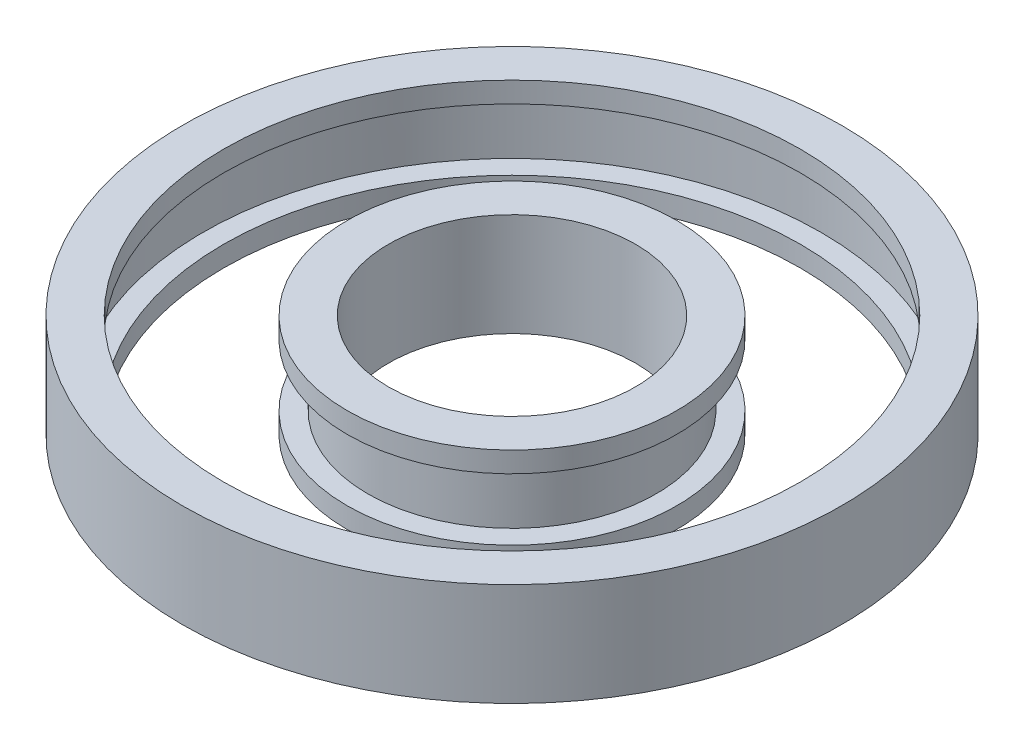
ISO-10303-21;
HEADER;
FILE_DESCRIPTION(('STEP AP214'),'2;1');
FILE_NAME('part.step','',(''),(''),'','','');
FILE_SCHEMA(('AUTOMOTIVE_DESIGN { 1 0 10303 214 1 1 1 1 }'));
ENDSEC;
DATA;
#1=APPLICATION_CONTEXT('core data for automotive mechanical design processes');
#2=APPLICATION_PROTOCOL_DEFINITION('international standard','automotive_design',2000,#1);
#3=PRODUCT_CONTEXT('',#1,'mechanical');
#4=PRODUCT('Part','Part','',(#3));
#5=PRODUCT_RELATED_PRODUCT_CATEGORY('part','',(#4));
#6=PRODUCT_DEFINITION_FORMATION('','',#4);
#7=PRODUCT_DEFINITION_CONTEXT('part definition',#1,'design');
#8=PRODUCT_DEFINITION('design','',#6,#7);
#9=PRODUCT_DEFINITION_SHAPE('','',#8);
#10=(LENGTH_UNIT() NAMED_UNIT(*) SI_UNIT(.MILLI.,.METRE.));
#11=(NAMED_UNIT(*) PLANE_ANGLE_UNIT() SI_UNIT($,.RADIAN.));
#12=(NAMED_UNIT(*) SI_UNIT($,.STERADIAN.) SOLID_ANGLE_UNIT());
#13=UNCERTAINTY_MEASURE_WITH_UNIT(LENGTH_MEASURE(1.E-05),#10,'distance_accuracy_value','');
#14=(GEOMETRIC_REPRESENTATION_CONTEXT(3) GLOBAL_UNCERTAINTY_ASSIGNED_CONTEXT((#13)) GLOBAL_UNIT_ASSIGNED_CONTEXT((#10,
#11,#12)) REPRESENTATION_CONTEXT('',''));
#15=CARTESIAN_POINT('',(0.,0.,0.));
#16=DIRECTION('',(0.,0.,1.));
#17=DIRECTION('',(1.,0.,0.));
#18=AXIS2_PLACEMENT_3D('',#15,#16,#17);
#19=CARTESIAN_POINT('',(-29.8525182831348,10.,11.5250662538269));
#20=DIRECTION('',(0.,-1.,0.));
#21=DIRECTION('',(0.,0.,-1.));
#22=AXIS2_PLACEMENT_3D('',#19,#20,#21);
#23=CYLINDRICAL_SURFACE('',#22,14.);
#24=CARTESIAN_POINT('',(-29.8525182831348,2.,11.5250662538269));
#25=DIRECTION('',(0.,-1.,0.));
#26=DIRECTION('',(0.,0.,-1.));
#27=AXIS2_PLACEMENT_3D('',#24,#25,#26);
#28=CIRCLE('',#27,14.);
#29=CARTESIAN_POINT('',(-29.8525182831348,2.,-2.47493374617309));
#30=VERTEX_POINT('',#29);
#31=EDGE_CURVE('E69',#30,#30,#28,.T.);
#32=ORIENTED_EDGE('',*,*,#31,.F.);
#33=EDGE_LOOP('',(#32));
#34=FACE_BOUND('',#33,.T.);
#35=CARTESIAN_POINT('',(-29.8525182831348,8.,11.5250662538269));
#36=DIRECTION('',(0.,1.,0.));
#37=DIRECTION('',(0.,0.,1.));
#38=AXIS2_PLACEMENT_3D('',#35,#36,#37);
#39=CIRCLE('',#38,14.);
#40=CARTESIAN_POINT('',(-29.8525182831348,8.,25.5250662538269));
#41=VERTEX_POINT('',#40);
#42=EDGE_CURVE('E78',#41,#41,#39,.T.);
#43=ORIENTED_EDGE('',*,*,#42,.F.);
#44=EDGE_LOOP('',(#43));
#45=FACE_BOUND('',#44,.T.);
#46=ADVANCED_FACE('F53',(#34,#45),#23,.T.);
#47=CARTESIAN_POINT('',(-29.8525182831348,10.,11.5250662538269));
#48=DIRECTION('',(0.,-1.,0.));
#49=DIRECTION('',(0.,0.,-1.));
#50=AXIS2_PLACEMENT_3D('',#47,#48,#49);
#51=CYLINDRICAL_SURFACE('',#50,12.);
#52=CARTESIAN_POINT('',(-29.8525182831348,10.,11.5250662538269));
#53=DIRECTION('',(0.,-1.,0.));
#54=DIRECTION('',(0.,0.,-1.));
#55=AXIS2_PLACEMENT_3D('',#52,#53,#54);
#56=CIRCLE('',#55,12.);
#57=CARTESIAN_POINT('',(-29.8525182831348,10.,-0.474933746173091));
#58=VERTEX_POINT('',#57);
#59=EDGE_CURVE('E11',#58,#58,#56,.T.);
#60=ORIENTED_EDGE('',*,*,#59,.F.);
#61=EDGE_LOOP('',(#60));
#62=FACE_BOUND('',#61,.T.);
#63=CARTESIAN_POINT('',(-29.8525182831348,0.,11.5250662538269));
#64=DIRECTION('',(0.,-1.,0.));
#65=DIRECTION('',(0.,0.,-1.));
#66=AXIS2_PLACEMENT_3D('',#63,#64,#65);
#67=CIRCLE('',#66,12.);
#68=CARTESIAN_POINT('',(-29.8525182831348,0.,-0.474933746173091));
#69=VERTEX_POINT('',#68);
#70=EDGE_CURVE('E57',#69,#69,#67,.T.);
#71=ORIENTED_EDGE('',*,*,#70,.T.);
#72=EDGE_LOOP('',(#71));
#73=FACE_BOUND('',#72,.T.);
#74=ADVANCED_FACE('F55',(#62,#73),#51,.F.);
#75=CARTESIAN_POINT('',(0.,10.,0.));
#76=DIRECTION('',(0.,-1.,0.));
#77=DIRECTION('',(0.,0.,-1.));
#78=AXIS2_PLACEMENT_3D('',#75,#76,#77);
#79=PLANE('',#78);
#80=ORIENTED_EDGE('',*,*,#59,.T.);
#81=EDGE_LOOP('',(#80));
#82=FACE_BOUND('',#81,.T.);
#83=CARTESIAN_POINT('',(-29.8525182831348,10.,11.5250662538269));
#84=DIRECTION('',(0.,1.,0.));
#85=DIRECTION('',(0.,0.,1.));
#86=AXIS2_PLACEMENT_3D('',#83,#84,#85);
#87=CIRCLE('',#86,16.);
#88=CARTESIAN_POINT('',(-29.8525182831348,10.,27.5250662538269));
#89=VERTEX_POINT('',#88);
#90=EDGE_CURVE('E75',#89,#89,#87,.T.);
#91=ORIENTED_EDGE('',*,*,#90,.T.);
#92=EDGE_LOOP('',(#91));
#93=FACE_BOUND('',#92,.T.);
#94=ADVANCED_FACE('F94',(#82,#93),#79,.F.);
#95=CARTESIAN_POINT('',(0.,0.,0.));
#96=DIRECTION('',(0.,-1.,0.));
#97=DIRECTION('',(0.,0.,-1.));
#98=AXIS2_PLACEMENT_3D('',#95,#96,#97);
#99=PLANE('',#98);
#100=ORIENTED_EDGE('',*,*,#70,.F.);
#101=EDGE_LOOP('',(#100));
#102=FACE_BOUND('',#101,.T.);
#103=CARTESIAN_POINT('',(-29.8525182831348,0.,11.5250662538269));
#104=DIRECTION('',(0.,-1.,0.));
#105=DIRECTION('',(0.,0.,-1.));
#106=AXIS2_PLACEMENT_3D('',#103,#104,#105);
#107=CIRCLE('',#106,16.);
#108=CARTESIAN_POINT('',(-29.8525182831348,0.,-4.47493374617309));
#109=VERTEX_POINT('',#108);
#110=EDGE_CURVE('E66',#109,#109,#107,.T.);
#111=ORIENTED_EDGE('',*,*,#110,.T.);
#112=EDGE_LOOP('',(#111));
#113=FACE_BOUND('',#112,.T.);
#114=ADVANCED_FACE('F98',(#102,#113),#99,.T.);
#115=CARTESIAN_POINT('',(-29.8525182831348,2.,11.5250662538269));
#116=DIRECTION('',(0.,-1.,0.));
#117=DIRECTION('',(0.,0.,-1.));
#118=AXIS2_PLACEMENT_3D('',#115,#116,#117);
#119=CYLINDRICAL_SURFACE('',#118,16.);
#120=CARTESIAN_POINT('',(-29.8525182831348,2.,11.5250662538269));
#121=DIRECTION('',(0.,-1.,0.));
#122=DIRECTION('',(0.,0.,-1.));
#123=AXIS2_PLACEMENT_3D('',#120,#121,#122);
#124=CIRCLE('',#123,16.);
#125=CARTESIAN_POINT('',(-29.8525182831348,2.,-4.47493374617309));
#126=VERTEX_POINT('',#125);
#127=EDGE_CURVE('E64',#126,#126,#124,.T.);
#128=ORIENTED_EDGE('',*,*,#127,.T.);
#129=EDGE_LOOP('',(#128));
#130=FACE_BOUND('',#129,.T.);
#131=ORIENTED_EDGE('',*,*,#110,.F.);
#132=EDGE_LOOP('',(#131));
#133=FACE_BOUND('',#132,.T.);
#134=ADVANCED_FACE('F101',(#130,#133),#119,.T.);
#135=CARTESIAN_POINT('',(0.,2.,0.));
#136=DIRECTION('',(0.,-1.,0.));
#137=DIRECTION('',(0.,0.,-1.));
#138=AXIS2_PLACEMENT_3D('',#135,#136,#137);
#139=PLANE('',#138);
#140=ORIENTED_EDGE('',*,*,#31,.T.);
#141=EDGE_LOOP('',(#140));
#142=FACE_BOUND('',#141,.T.);
#143=ORIENTED_EDGE('',*,*,#127,.F.);
#144=EDGE_LOOP('',(#143));
#145=FACE_BOUND('',#144,.T.);
#146=ADVANCED_FACE('F106',(#142,#145),#139,.F.);
#147=CARTESIAN_POINT('',(-29.8525182831348,8.,11.5250662538269));
#148=DIRECTION('',(0.,1.,0.));
#149=DIRECTION('',(0.,0.,1.));
#150=AXIS2_PLACEMENT_3D('',#147,#148,#149);
#151=CYLINDRICAL_SURFACE('',#150,16.);
#152=CARTESIAN_POINT('',(-29.8525182831348,8.,11.5250662538269));
#153=DIRECTION('',(0.,1.,0.));
#154=DIRECTION('',(0.,0.,1.));
#155=AXIS2_PLACEMENT_3D('',#152,#153,#154);
#156=CIRCLE('',#155,16.);
#157=CARTESIAN_POINT('',(-29.8525182831348,8.,27.5250662538269));
#158=VERTEX_POINT('',#157);
#159=EDGE_CURVE('E70',#158,#158,#156,.T.);
#160=ORIENTED_EDGE('',*,*,#159,.T.);
#161=EDGE_LOOP('',(#160));
#162=FACE_BOUND('',#161,.T.);
#163=ORIENTED_EDGE('',*,*,#90,.F.);
#164=EDGE_LOOP('',(#163));
#165=FACE_BOUND('',#164,.T.);
#166=ADVANCED_FACE('F109',(#162,#165),#151,.T.);
#167=CARTESIAN_POINT('',(-29.8525182831348,8.,11.5250662538269));
#168=DIRECTION('',(0.,1.,0.));
#169=DIRECTION('',(0.,0.,1.));
#170=AXIS2_PLACEMENT_3D('',#167,#168,#169);
#171=PLANE('',#170);
#172=ORIENTED_EDGE('',*,*,#42,.T.);
#173=EDGE_LOOP('',(#172));
#174=FACE_BOUND('',#173,.T.);
#175=ORIENTED_EDGE('',*,*,#159,.F.);
#176=EDGE_LOOP('',(#175));
#177=FACE_BOUND('',#176,.T.);
#178=ADVANCED_FACE('F84',(#174,#177),#171,.F.);
#179=CLOSED_SHELL('',(#46,#74,#94,#114,#134,#146,#166,#178));
#180=MANIFOLD_SOLID_BREP('B2',#179);
#181=CARTESIAN_POINT('',(-29.8525182831348,10.,11.5250662538269));
#182=DIRECTION('',(0.,-1.,0.));
#183=DIRECTION('',(0.,0.,-1.));
#184=AXIS2_PLACEMENT_3D('',#181,#182,#183);
#185=CYLINDRICAL_SURFACE('',#184,30.);
#186=CARTESIAN_POINT('',(-29.8525182831348,2.,11.5250662538269));
#187=DIRECTION('',(0.,-1.,0.));
#188=DIRECTION('',(0.,0.,-1.));
#189=AXIS2_PLACEMENT_3D('',#186,#187,#188);
#190=CIRCLE('',#189,30.);
#191=CARTESIAN_POINT('',(-29.8525182831348,2.,-18.4749337461731));
#192=VERTEX_POINT('',#191);
#193=EDGE_CURVE('E194',#192,#192,#190,.T.);
#194=ORIENTED_EDGE('',*,*,#193,.T.);
#195=EDGE_LOOP('',(#194));
#196=FACE_BOUND('',#195,.T.);
#197=CARTESIAN_POINT('',(-29.8525182831348,8.,11.5250662538269));
#198=DIRECTION('',(0.,1.,0.));
#199=DIRECTION('',(0.,0.,1.));
#200=AXIS2_PLACEMENT_3D('',#197,#198,#199);
#201=CIRCLE('',#200,30.);
#202=CARTESIAN_POINT('',(-29.8525182831348,8.,41.5250662538269));
#203=VERTEX_POINT('',#202);
#204=EDGE_CURVE('E204',#203,#203,#201,.T.);
#205=ORIENTED_EDGE('',*,*,#204,.T.);
#206=EDGE_LOOP('',(#205));
#207=FACE_BOUND('',#206,.T.);
#208=ADVANCED_FACE('F181',(#196,#207),#185,.F.);
#209=CARTESIAN_POINT('',(-29.8525182831348,10.,11.5250662538269));
#210=DIRECTION('',(0.,1.,0.));
#211=DIRECTION('',(0.,0.,1.));
#212=AXIS2_PLACEMENT_3D('',#209,#210,#211);
#213=PLANE('',#212);
#214=CARTESIAN_POINT('',(-29.8525182831348,10.,11.5250662538269));
#215=DIRECTION('',(0.,1.,0.));
#216=DIRECTION('',(0.,0.,1.));
#217=AXIS2_PLACEMENT_3D('',#214,#215,#216);
#218=CIRCLE('',#217,32.);
#219=CARTESIAN_POINT('',(-29.8525182831348,10.,43.5250662538269));
#220=VERTEX_POINT('',#219);
#221=EDGE_CURVE('E52',#220,#220,#218,.T.);
#222=ORIENTED_EDGE('',*,*,#221,.T.);
#223=EDGE_LOOP('',(#222));
#224=FACE_BOUND('',#223,.T.);
#225=CARTESIAN_POINT('',(-29.8525182831348,10.,11.5250662538269));
#226=DIRECTION('',(0.,1.,0.));
#227=DIRECTION('',(0.,0.,1.));
#228=AXIS2_PLACEMENT_3D('',#225,#226,#227);
#229=CIRCLE('',#228,28.);
#230=CARTESIAN_POINT('',(-29.8525182831348,10.,39.5250662538269));
#231=VERTEX_POINT('',#230);
#232=EDGE_CURVE('E212',#231,#231,#229,.T.);
#233=ORIENTED_EDGE('',*,*,#232,.F.);
#234=EDGE_LOOP('',(#233));
#235=FACE_BOUND('',#234,.T.);
#236=ADVANCED_FACE('F229',(#224,#235),#213,.T.);
#237=CARTESIAN_POINT('',(-29.8525182831348,0.,11.5250662538269));
#238=DIRECTION('',(0.,1.,0.));
#239=DIRECTION('',(0.,0.,1.));
#240=AXIS2_PLACEMENT_3D('',#237,#238,#239);
#241=PLANE('',#240);
#242=CARTESIAN_POINT('',(-29.8525182831348,0.,11.5250662538269));
#243=DIRECTION('',(0.,1.,0.));
#244=DIRECTION('',(0.,0.,1.));
#245=AXIS2_PLACEMENT_3D('',#242,#243,#244);
#246=CIRCLE('',#245,32.);
#247=CARTESIAN_POINT('',(-29.8525182831348,0.,43.5250662538269));
#248=VERTEX_POINT('',#247);
#249=EDGE_CURVE('E185',#248,#248,#246,.T.);
#250=ORIENTED_EDGE('',*,*,#249,.F.);
#251=EDGE_LOOP('',(#250));
#252=FACE_BOUND('',#251,.T.);
#253=CARTESIAN_POINT('',(-29.8525182831348,0.,11.5250662538269));
#254=DIRECTION('',(0.,-1.,0.));
#255=DIRECTION('',(0.,0.,-1.));
#256=AXIS2_PLACEMENT_3D('',#253,#254,#255);
#257=CIRCLE('',#256,28.);
#258=CARTESIAN_POINT('',(-29.8525182831348,0.,-16.4749337461731));
#259=VERTEX_POINT('',#258);
#260=EDGE_CURVE('E200',#259,#259,#257,.T.);
#261=ORIENTED_EDGE('',*,*,#260,.F.);
#262=EDGE_LOOP('',(#261));
#263=FACE_BOUND('',#262,.T.);
#264=ADVANCED_FACE('F231',(#252,#263),#241,.F.);
#265=CARTESIAN_POINT('',(-29.8525182831348,10.,11.5250662538269));
#266=DIRECTION('',(0.,-1.,0.));
#267=DIRECTION('',(0.,0.,-1.));
#268=AXIS2_PLACEMENT_3D('',#265,#266,#267);
#269=CYLINDRICAL_SURFACE('',#268,32.);
#270=ORIENTED_EDGE('',*,*,#221,.F.);
#271=EDGE_LOOP('',(#270));
#272=FACE_BOUND('',#271,.T.);
#273=ORIENTED_EDGE('',*,*,#249,.T.);
#274=EDGE_LOOP('',(#273));
#275=FACE_BOUND('',#274,.T.);
#276=ADVANCED_FACE('F183',(#272,#275),#269,.T.);
#277=CARTESIAN_POINT('',(-29.8525182831348,2.,11.5250662538269));
#278=DIRECTION('',(0.,-1.,0.));
#279=DIRECTION('',(0.,0.,-1.));
#280=AXIS2_PLACEMENT_3D('',#277,#278,#279);
#281=PLANE('',#280);
#282=CARTESIAN_POINT('',(-29.8525182831348,2.,11.5250662538269));
#283=DIRECTION('',(0.,-1.,0.));
#284=DIRECTION('',(0.,0.,-1.));
#285=AXIS2_PLACEMENT_3D('',#282,#283,#284);
#286=CIRCLE('',#285,28.);
#287=CARTESIAN_POINT('',(-29.8525182831348,2.,-16.4749337461731));
#288=VERTEX_POINT('',#287);
#289=EDGE_CURVE('E199',#288,#288,#286,.T.);
#290=ORIENTED_EDGE('',*,*,#289,.T.);
#291=EDGE_LOOP('',(#290));
#292=FACE_BOUND('',#291,.T.);
#293=ORIENTED_EDGE('',*,*,#193,.F.);
#294=EDGE_LOOP('',(#293));
#295=FACE_BOUND('',#294,.T.);
#296=ADVANCED_FACE('F242',(#292,#295),#281,.F.);
#297=CARTESIAN_POINT('',(-29.8525182831348,2.,11.5250662538269));
#298=DIRECTION('',(0.,-1.,0.));
#299=DIRECTION('',(0.,0.,-1.));
#300=AXIS2_PLACEMENT_3D('',#297,#298,#299);
#301=CYLINDRICAL_SURFACE('',#300,28.);
#302=ORIENTED_EDGE('',*,*,#289,.F.);
#303=EDGE_LOOP('',(#302));
#304=FACE_BOUND('',#303,.T.);
#305=ORIENTED_EDGE('',*,*,#260,.T.);
#306=EDGE_LOOP('',(#305));
#307=FACE_BOUND('',#306,.T.);
#308=ADVANCED_FACE('F245',(#304,#307),#301,.F.);
#309=CARTESIAN_POINT('',(-29.8525182831348,8.,11.5250662538269));
#310=DIRECTION('',(0.,1.,0.));
#311=DIRECTION('',(0.,0.,1.));
#312=AXIS2_PLACEMENT_3D('',#309,#310,#311);
#313=PLANE('',#312);
#314=CARTESIAN_POINT('',(-29.8525182831348,8.,11.5250662538269));
#315=DIRECTION('',(0.,1.,0.));
#316=DIRECTION('',(0.,0.,1.));
#317=AXIS2_PLACEMENT_3D('',#314,#315,#316);
#318=CIRCLE('',#317,28.);
#319=CARTESIAN_POINT('',(-29.8525182831348,8.,39.5250662538269));
#320=VERTEX_POINT('',#319);
#321=EDGE_CURVE('E211',#320,#320,#318,.T.);
#322=ORIENTED_EDGE('',*,*,#321,.T.);
#323=EDGE_LOOP('',(#322));
#324=FACE_BOUND('',#323,.T.);
#325=ORIENTED_EDGE('',*,*,#204,.F.);
#326=EDGE_LOOP('',(#325));
#327=FACE_BOUND('',#326,.T.);
#328=ADVANCED_FACE('F220',(#324,#327),#313,.F.);
#329=CARTESIAN_POINT('',(-29.8525182831348,8.,11.5250662538269));
#330=DIRECTION('',(0.,1.,0.));
#331=DIRECTION('',(0.,0.,1.));
#332=AXIS2_PLACEMENT_3D('',#329,#330,#331);
#333=CYLINDRICAL_SURFACE('',#332,28.);
#334=ORIENTED_EDGE('',*,*,#321,.F.);
#335=EDGE_LOOP('',(#334));
#336=FACE_BOUND('',#335,.T.);
#337=ORIENTED_EDGE('',*,*,#232,.T.);
#338=EDGE_LOOP('',(#337));
#339=FACE_BOUND('',#338,.T.);
#340=ADVANCED_FACE('F223',(#336,#339),#333,.F.);
#341=CLOSED_SHELL('',(#208,#236,#264,#276,#296,#308,#328,#340));
#342=MANIFOLD_SOLID_BREP('B6',#341);
#343=ADVANCED_BREP_SHAPE_REPRESENTATION('',(#18,#180,#342),#14);
#344=SHAPE_DEFINITION_REPRESENTATION(#9,#343);
ENDSEC;
END-ISO-10303-21;
